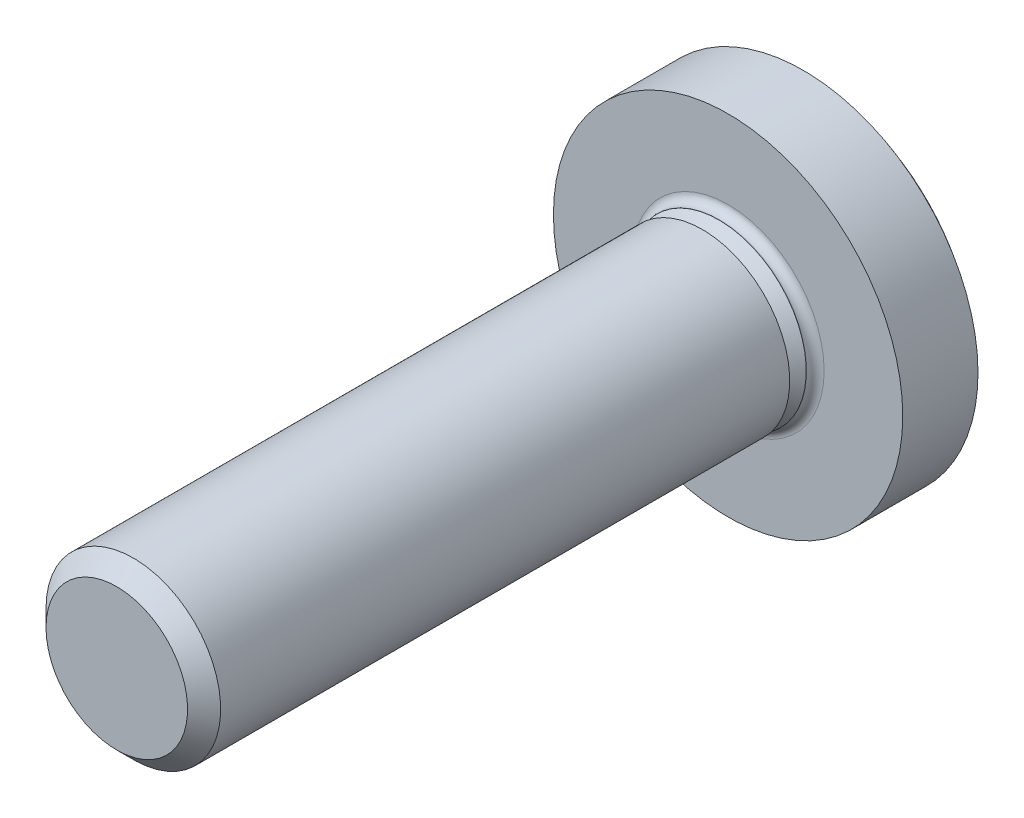
ISO-10303-21;
HEADER;
FILE_DESCRIPTION(('STEP AP214'),'2;1');
FILE_NAME('part.step','',(''),(''),'','','');
FILE_SCHEMA(('AUTOMOTIVE_DESIGN { 1 0 10303 214 1 1 1 1 }'));
ENDSEC;
DATA;
#1=APPLICATION_CONTEXT('core data for automotive mechanical design processes');
#2=APPLICATION_PROTOCOL_DEFINITION('international standard','automotive_design',2000,#1);
#3=PRODUCT_CONTEXT('',#1,'mechanical');
#4=PRODUCT('Part','Part','',(#3));
#5=PRODUCT_RELATED_PRODUCT_CATEGORY('part','',(#4));
#6=PRODUCT_DEFINITION_FORMATION('','',#4);
#7=PRODUCT_DEFINITION_CONTEXT('part definition',#1,'design');
#8=PRODUCT_DEFINITION('design','',#6,#7);
#9=PRODUCT_DEFINITION_SHAPE('','',#8);
#10=(LENGTH_UNIT() NAMED_UNIT(*) SI_UNIT(.MILLI.,.METRE.));
#11=(NAMED_UNIT(*) PLANE_ANGLE_UNIT() SI_UNIT($,.RADIAN.));
#12=(NAMED_UNIT(*) SI_UNIT($,.STERADIAN.) SOLID_ANGLE_UNIT());
#13=UNCERTAINTY_MEASURE_WITH_UNIT(LENGTH_MEASURE(1.E-05),#10,'distance_accuracy_value','');
#14=(GEOMETRIC_REPRESENTATION_CONTEXT(3) GLOBAL_UNCERTAINTY_ASSIGNED_CONTEXT((#13)) GLOBAL_UNIT_ASSIGNED_CONTEXT((#10,
#11,#12)) REPRESENTATION_CONTEXT('',''));
#15=CARTESIAN_POINT('',(0.,0.,0.));
#16=DIRECTION('',(0.,0.,1.));
#17=DIRECTION('',(1.,0.,0.));
#18=AXIS2_PLACEMENT_3D('',#15,#16,#17);
#19=CARTESIAN_POINT('',(0.,0.,6.5));
#20=DIRECTION('',(0.,0.,-1.));
#21=DIRECTION('',(0.,1.,0.));
#22=AXIS2_PLACEMENT_3D('',#19,#20,#21);
#23=SPHERICAL_SURFACE('',#22,6.5);
#24=CARTESIAN_POINT('',(0.,0.,1.3765246170202));
#25=DIRECTION('',(0.,0.,-1.));
#26=DIRECTION('',(-1.,0.,0.));
#27=AXIS2_PLACEMENT_3D('',#24,#25,#26);
#28=CIRCLE('',#27,4.);
#29=CARTESIAN_POINT('',(-4.,0.,1.3765246170202));
#30=VERTEX_POINT('',#29);
#31=EDGE_CURVE('E160',#30,#30,#28,.T.);
#32=ORIENTED_EDGE('',*,*,#31,.T.);
#33=EDGE_LOOP('',(#32));
#34=FACE_BOUND('',#33,.T.);
#35=CARTESIAN_POINT('',(-0.405545392562274,0.189108922281263,6.3801008200685));
#36=DIRECTION('',(-0.875426098065593,0.408217893676735,-0.258819045102521));
#37=DIRECTION('',(-0.422618261740699,-0.90630778703665,0.));
#38=AXIS2_PLACEMENT_3D('',#35,#36,#37);
#39=CIRCLE('',#38,6.48347090197349);
#40=CARTESIAN_POINT('',(0.92299563807694,-0.92299563807694,0.132413478861721));
#41=VERTEX_POINT('',#40);
#42=CARTESIAN_POINT('',(0.305622674506346,-2.10418012593627,0.35760463838069));
#43=VERTEX_POINT('',#42);
#44=EDGE_CURVE('E9',#41,#43,#39,.T.);
#45=ORIENTED_EDGE('',*,*,#44,.F.);
#46=CARTESIAN_POINT('',(-0.189108922281263,0.405545392562274,6.3801008200685));
#47=DIRECTION('',(-0.408217893676735,0.875426098065593,-0.258819045102521));
#48=DIRECTION('',(-0.90630778703665,-0.422618261740699,0.));
#49=AXIS2_PLACEMENT_3D('',#46,#47,#48);
#50=CIRCLE('',#49,6.48347090197349);
#51=CARTESIAN_POINT('',(2.10418012593627,-0.305622674506346,0.357604638380691));
#52=VERTEX_POINT('',#51);
#53=EDGE_CURVE('E24',#52,#41,#50,.T.);
#54=ORIENTED_EDGE('',*,*,#53,.F.);
#55=CARTESIAN_POINT('',(0.427627944162883,0.,6.61458256229943));
#56=DIRECTION('',(-0.965925826289068,0.,-0.258819045102521));
#57=DIRECTION('',(-0.258819045102521,0.,0.965925826289068));
#58=AXIS2_PLACEMENT_3D('',#55,#56,#57);
#59=CIRCLE('',#58,6.48490594980281);
#60=CARTESIAN_POINT('',(2.10418012593627,0.305622674506346,0.357604638380691));
#61=VERTEX_POINT('',#60);
#62=EDGE_CURVE('E224',#61,#52,#59,.T.);
#63=ORIENTED_EDGE('',*,*,#62,.F.);
#64=CARTESIAN_POINT('',(-0.189108922281263,-0.405545392562275,6.3801008200685));
#65=DIRECTION('',(-0.408217893676735,-0.875426098065593,-0.258819045102521));
#66=DIRECTION('',(0.90630778703665,-0.422618261740699,0.));
#67=AXIS2_PLACEMENT_3D('',#64,#65,#66);
#68=CIRCLE('',#67,6.48347090197349);
#69=CARTESIAN_POINT('',(0.922995638076941,0.922995638076939,0.132413478861721));
#70=VERTEX_POINT('',#69);
#71=EDGE_CURVE('E221',#70,#61,#68,.T.);
#72=ORIENTED_EDGE('',*,*,#71,.F.);
#73=CARTESIAN_POINT('',(-0.405545392562273,-0.189108922281263,6.3801008200685));
#74=DIRECTION('',(-0.875426098065593,-0.408217893676735,-0.258819045102521));
#75=DIRECTION('',(0.422618261740699,-0.90630778703665,0.));
#76=AXIS2_PLACEMENT_3D('',#73,#74,#75);
#77=CIRCLE('',#76,6.48347090197349);
#78=CARTESIAN_POINT('',(0.305622674506346,2.10418012593627,0.35760463838069));
#79=VERTEX_POINT('',#78);
#80=EDGE_CURVE('E218',#79,#70,#77,.T.);
#81=ORIENTED_EDGE('',*,*,#80,.F.);
#82=CARTESIAN_POINT('',(0.,0.427627944162883,6.61458256229943));
#83=DIRECTION('',(0.,-0.965925826289068,-0.258819045102521));
#84=DIRECTION('',(0.,0.258819045102521,-0.965925826289068));
#85=AXIS2_PLACEMENT_3D('',#82,#83,#84);
#86=CIRCLE('',#85,6.48490594980281);
#87=CARTESIAN_POINT('',(-0.305622674506345,2.10418012593627,0.35760463838069));
#88=VERTEX_POINT('',#87);
#89=EDGE_CURVE('E215',#88,#79,#86,.T.);
#90=ORIENTED_EDGE('',*,*,#89,.F.);
#91=CARTESIAN_POINT('',(0.405545392562275,-0.189108922281263,6.3801008200685));
#92=DIRECTION('',(0.875426098065593,-0.408217893676735,-0.258819045102521));
#93=DIRECTION('',(0.422618261740699,0.90630778703665,0.));
#94=AXIS2_PLACEMENT_3D('',#91,#92,#93);
#95=CIRCLE('',#94,6.48347090197349);
#96=CARTESIAN_POINT('',(-0.92299563807694,0.922995638076941,0.132413478861721));
#97=VERTEX_POINT('',#96);
#98=EDGE_CURVE('E212',#97,#88,#95,.T.);
#99=ORIENTED_EDGE('',*,*,#98,.F.);
#100=CARTESIAN_POINT('',(0.189108922281263,-0.405545392562273,6.3801008200685));
#101=DIRECTION('',(0.408217893676735,-0.875426098065593,-0.258819045102521));
#102=DIRECTION('',(0.90630778703665,0.422618261740699,0.));
#103=AXIS2_PLACEMENT_3D('',#100,#101,#102);
#104=CIRCLE('',#103,6.48347090197349);
#105=CARTESIAN_POINT('',(-2.10418012593627,0.305622674506346,0.35760463838069));
#106=VERTEX_POINT('',#105);
#107=EDGE_CURVE('E209',#106,#97,#104,.T.);
#108=ORIENTED_EDGE('',*,*,#107,.F.);
#109=CARTESIAN_POINT('',(-0.427627944162883,0.,6.61458256229943));
#110=DIRECTION('',(0.965925826289068,0.,-0.258819045102521));
#111=DIRECTION('',(-0.258819045102521,0.,-0.965925826289068));
#112=AXIS2_PLACEMENT_3D('',#109,#110,#111);
#113=CIRCLE('',#112,6.48490594980281);
#114=CARTESIAN_POINT('',(-2.10418012593627,-0.305622674506345,0.357604638380691));
#115=VERTEX_POINT('',#114);
#116=EDGE_CURVE('E206',#115,#106,#113,.T.);
#117=ORIENTED_EDGE('',*,*,#116,.F.);
#118=CARTESIAN_POINT('',(0.189108922281264,0.405545392562274,6.3801008200685));
#119=DIRECTION('',(0.408217893676735,0.875426098065593,-0.258819045102521));
#120=DIRECTION('',(-0.90630778703665,0.422618261740699,0.));
#121=AXIS2_PLACEMENT_3D('',#118,#119,#120);
#122=CIRCLE('',#121,6.48347090197349);
#123=CARTESIAN_POINT('',(-0.922995638076941,-0.92299563807694,0.132413478861721));
#124=VERTEX_POINT('',#123);
#125=EDGE_CURVE('E203',#124,#115,#122,.T.);
#126=ORIENTED_EDGE('',*,*,#125,.F.);
#127=CARTESIAN_POINT('',(0.405545392562273,0.189108922281263,6.3801008200685));
#128=DIRECTION('',(0.875426098065593,0.408217893676735,-0.258819045102521));
#129=DIRECTION('',(-0.422618261740699,0.90630778703665,0.));
#130=AXIS2_PLACEMENT_3D('',#127,#128,#129);
#131=CIRCLE('',#130,6.48347090197349);
#132=CARTESIAN_POINT('',(-0.305622674506346,-2.10418012593627,0.357604638380691));
#133=VERTEX_POINT('',#132);
#134=EDGE_CURVE('E200',#133,#124,#131,.T.);
#135=ORIENTED_EDGE('',*,*,#134,.F.);
#136=CARTESIAN_POINT('',(0.,-0.427627944162883,6.61458256229943));
#137=DIRECTION('',(0.,0.965925826289068,-0.258819045102521));
#138=DIRECTION('',(0.,0.258819045102521,0.965925826289068));
#139=AXIS2_PLACEMENT_3D('',#136,#137,#138);
#140=CIRCLE('',#139,6.48490594980281);
#141=EDGE_CURVE('E197',#43,#133,#140,.T.);
#142=ORIENTED_EDGE('',*,*,#141,.F.);
#143=EDGE_LOOP('',(#45,#54,#63,#72,#81,#90,#99,#108,#117,#126,#135,#142));
#144=FACE_BOUND('',#143,.T.);
#145=ADVANCED_FACE('F15',(#34,#144),#23,.T.);
#146=CARTESIAN_POINT('',(0.,0.,17.1));
#147=DIRECTION('',(0.,0.,-1.));
#148=DIRECTION('',(-1.,0.,0.));
#149=AXIS2_PLACEMENT_3D('',#146,#147,#148);
#150=PLANE('',#149);
#151=CARTESIAN_POINT('',(0.,0.,17.1));
#152=DIRECTION('',(0.,0.,-1.));
#153=DIRECTION('',(-1.,0.,0.));
#154=AXIS2_PLACEMENT_3D('',#151,#152,#153);
#155=CIRCLE('',#154,1.621125);
#156=CARTESIAN_POINT('',(-1.621125,0.,17.1));
#157=VERTEX_POINT('',#156);
#158=EDGE_CURVE('E193',#157,#157,#155,.T.);
#159=ORIENTED_EDGE('',*,*,#158,.F.);
#160=EDGE_LOOP('',(#159));
#161=FACE_BOUND('',#160,.T.);
#162=ADVANCED_FACE('F17',(#161),#150,.F.);
#163=CARTESIAN_POINT('',(0.,0.,17.1));
#164=DIRECTION('',(0.,0.,-1.));
#165=DIRECTION('',(-1.,0.,0.));
#166=AXIS2_PLACEMENT_3D('',#163,#164,#165);
#167=CONICAL_SURFACE('',#166,1.621125,0.785398163397448);
#168=CARTESIAN_POINT('',(0.,0.,16.721125));
#169=DIRECTION('',(0.,0.,-1.));
#170=DIRECTION('',(-1.,0.,0.));
#171=AXIS2_PLACEMENT_3D('',#168,#169,#170);
#172=CIRCLE('',#171,2.);
#173=CARTESIAN_POINT('',(-2.,0.,16.721125));
#174=VERTEX_POINT('',#173);
#175=EDGE_CURVE('E189',#174,#174,#172,.T.);
#176=ORIENTED_EDGE('',*,*,#175,.F.);
#177=EDGE_LOOP('',(#176));
#178=FACE_BOUND('',#177,.T.);
#179=ORIENTED_EDGE('',*,*,#158,.T.);
#180=EDGE_LOOP('',(#179));
#181=FACE_BOUND('',#180,.T.);
#182=ADVANCED_FACE('F245',(#178,#181),#167,.T.);
#183=CARTESIAN_POINT('',(0.,0.,0.));
#184=DIRECTION('',(0.,0.,-1.));
#185=DIRECTION('',(-1.,0.,0.));
#186=AXIS2_PLACEMENT_3D('',#183,#184,#185);
#187=CYLINDRICAL_SURFACE('',#186,2.);
#188=CARTESIAN_POINT('',(0.,0.,3.688875));
#189=DIRECTION('',(0.,0.,-1.));
#190=DIRECTION('',(-1.,0.,0.));
#191=AXIS2_PLACEMENT_3D('',#188,#189,#190);
#192=CIRCLE('',#191,2.);
#193=CARTESIAN_POINT('',(-2.,0.,3.688875));
#194=VERTEX_POINT('',#193);
#195=EDGE_CURVE('E185',#194,#194,#192,.T.);
#196=ORIENTED_EDGE('',*,*,#195,.F.);
#197=EDGE_LOOP('',(#196));
#198=FACE_BOUND('',#197,.T.);
#199=ORIENTED_EDGE('',*,*,#175,.T.);
#200=EDGE_LOOP('',(#199));
#201=FACE_BOUND('',#200,.T.);
#202=ADVANCED_FACE('F256',(#198,#201),#187,.T.);
#203=CARTESIAN_POINT('',(0.,2.,3.688875));
#204=DIRECTION('',(0.,0.,1.));
#205=DIRECTION('',(1.,0.,0.));
#206=AXIS2_PLACEMENT_3D('',#203,#204,#205);
#207=PLANE('',#206);
#208=CARTESIAN_POINT('',(0.,0.,3.688875));
#209=DIRECTION('',(0.,0.,-1.));
#210=DIRECTION('',(-1.,0.,0.));
#211=AXIS2_PLACEMENT_3D('',#208,#209,#210);
#212=CIRCLE('',#211,1.621125);
#213=CARTESIAN_POINT('',(-1.621125,0.,3.688875));
#214=VERTEX_POINT('',#213);
#215=EDGE_CURVE('E181',#214,#214,#212,.T.);
#216=ORIENTED_EDGE('',*,*,#215,.F.);
#217=EDGE_LOOP('',(#216));
#218=FACE_BOUND('',#217,.T.);
#219=ORIENTED_EDGE('',*,*,#195,.T.);
#220=EDGE_LOOP('',(#219));
#221=FACE_BOUND('',#220,.T.);
#222=ADVANCED_FACE('F265',(#218,#221),#207,.F.);
#223=CARTESIAN_POINT('',(0.,0.,3.688875));
#224=DIRECTION('',(0.,0.,-1.));
#225=DIRECTION('',(-1.,0.,0.));
#226=AXIS2_PLACEMENT_3D('',#223,#224,#225);
#227=CONICAL_SURFACE('',#226,1.621125,0.785398163397448);
#228=CARTESIAN_POINT('',(0.,0.,3.31));
#229=DIRECTION('',(0.,0.,-1.));
#230=DIRECTION('',(-1.,0.,0.));
#231=AXIS2_PLACEMENT_3D('',#228,#229,#230);
#232=CIRCLE('',#231,2.);
#233=CARTESIAN_POINT('',(-2.,0.,3.31));
#234=VERTEX_POINT('',#233);
#235=EDGE_CURVE('E177',#234,#234,#232,.T.);
#236=ORIENTED_EDGE('',*,*,#235,.F.);
#237=EDGE_LOOP('',(#236));
#238=FACE_BOUND('',#237,.T.);
#239=ORIENTED_EDGE('',*,*,#215,.T.);
#240=EDGE_LOOP('',(#239));
#241=FACE_BOUND('',#240,.T.);
#242=ADVANCED_FACE('F275',(#238,#241),#227,.T.);
#243=CARTESIAN_POINT('',(0.,0.,0.));
#244=DIRECTION('',(0.,0.,-1.));
#245=DIRECTION('',(-1.,0.,0.));
#246=AXIS2_PLACEMENT_3D('',#243,#244,#245);
#247=CYLINDRICAL_SURFACE('',#246,2.);
#248=CARTESIAN_POINT('',(0.,0.,3.3));
#249=DIRECTION('',(0.,0.,-1.));
#250=DIRECTION('',(-1.,0.,0.));
#251=AXIS2_PLACEMENT_3D('',#248,#249,#250);
#252=CIRCLE('',#251,2.);
#253=CARTESIAN_POINT('',(-2.,0.,3.3));
#254=VERTEX_POINT('',#253);
#255=EDGE_CURVE('E173',#254,#254,#252,.T.);
#256=ORIENTED_EDGE('',*,*,#255,.F.);
#257=EDGE_LOOP('',(#256));
#258=FACE_BOUND('',#257,.T.);
#259=ORIENTED_EDGE('',*,*,#235,.T.);
#260=EDGE_LOOP('',(#259));
#261=FACE_BOUND('',#260,.T.);
#262=ADVANCED_FACE('F285',(#258,#261),#247,.T.);
#263=CARTESIAN_POINT('',(0.,0.,3.3));
#264=DIRECTION('',(0.,0.,-1.));
#265=DIRECTION('',(-1.,0.,0.));
#266=AXIS2_PLACEMENT_3D('',#263,#264,#265);
#267=TOROIDAL_SURFACE('',#266,2.2,0.2);
#268=ORIENTED_EDGE('',*,*,#255,.T.);
#269=EDGE_LOOP('',(#268));
#270=FACE_BOUND('',#269,.T.);
#271=CARTESIAN_POINT('',(0.,0.,3.1));
#272=DIRECTION('',(0.,0.,-1.));
#273=DIRECTION('',(-1.,0.,0.));
#274=AXIS2_PLACEMENT_3D('',#271,#272,#273);
#275=CIRCLE('',#274,2.2);
#276=CARTESIAN_POINT('',(-2.2,0.,3.1));
#277=VERTEX_POINT('',#276);
#278=EDGE_CURVE('E169',#277,#277,#275,.T.);
#279=ORIENTED_EDGE('',*,*,#278,.F.);
#280=EDGE_LOOP('',(#279));
#281=FACE_BOUND('',#280,.T.);
#282=ADVANCED_FACE('F295',(#270,#281),#267,.F.);
#283=CARTESIAN_POINT('',(0.,2.2,3.1));
#284=DIRECTION('',(0.,0.,-1.));
#285=DIRECTION('',(-1.,0.,0.));
#286=AXIS2_PLACEMENT_3D('',#283,#284,#285);
#287=PLANE('',#286);
#288=CARTESIAN_POINT('',(0.,0.,3.1));
#289=DIRECTION('',(0.,0.,-1.));
#290=DIRECTION('',(-1.,0.,0.));
#291=AXIS2_PLACEMENT_3D('',#288,#289,#290);
#292=CIRCLE('',#291,4.);
#293=CARTESIAN_POINT('',(-4.,0.,3.1));
#294=VERTEX_POINT('',#293);
#295=EDGE_CURVE('E164',#294,#294,#292,.T.);
#296=ORIENTED_EDGE('',*,*,#295,.F.);
#297=EDGE_LOOP('',(#296));
#298=FACE_BOUND('',#297,.T.);
#299=ORIENTED_EDGE('',*,*,#278,.T.);
#300=EDGE_LOOP('',(#299));
#301=FACE_BOUND('',#300,.T.);
#302=ADVANCED_FACE('F305',(#298,#301),#287,.F.);
#303=CARTESIAN_POINT('',(0.,0.,0.));
#304=DIRECTION('',(0.,0.,-1.));
#305=DIRECTION('',(-1.,0.,0.));
#306=AXIS2_PLACEMENT_3D('',#303,#304,#305);
#307=CYLINDRICAL_SURFACE('',#306,4.);
#308=ORIENTED_EDGE('',*,*,#31,.F.);
#309=EDGE_LOOP('',(#308));
#310=FACE_BOUND('',#309,.T.);
#311=ORIENTED_EDGE('',*,*,#295,.T.);
#312=EDGE_LOOP('',(#311));
#313=FACE_BOUND('',#312,.T.);
#314=ADVANCED_FACE('F315',(#310,#313),#307,.T.);
#315=CARTESIAN_POINT('',(0.366666666666667,-2.2,0.));
#316=DIRECTION('',(-0.875426098065593,0.408217893676735,-0.258819045102521));
#317=DIRECTION('',(-0.422618261740699,-0.90630778703665,0.));
#318=AXIS2_PLACEMENT_3D('',#315,#316,#317);
#319=PLANE('',#318);
#320=ORIENTED_EDGE('',*,*,#44,.T.);
#321=DIRECTION('',(0.162689201767992,-0.255370893567974,-0.953057149569945));
#322=VECTOR('',#321,1.);
#323=CARTESIAN_POINT('',(0.366666666666667,-2.2,0.));
#324=LINE('',#323,#322);
#325=CARTESIAN_POINT('',(0.0423319890466869,-1.69089653438087,1.9));
#326=VERTEX_POINT('',#325);
#327=EDGE_CURVE('E31',#326,#43,#324,.T.);
#328=ORIENTED_EDGE('',*,*,#327,.F.);
#329=DIRECTION('',(0.422618261740699,0.90630778703665,0.));
#330=VECTOR('',#329,1.);
#331=CARTESIAN_POINT('',(0.149047069992156,-1.46204530477057,1.9));
#332=LINE('',#331,#330);
#333=CARTESIAN_POINT('',(0.566600049829658,-0.566600049829659,1.9));
#334=VERTEX_POINT('',#333);
#335=EDGE_CURVE('E117',#326,#334,#332,.T.);
#336=ORIENTED_EDGE('',*,*,#335,.T.);
#337=DIRECTION('',(0.193899607686987,-0.193899607686987,-0.961668281829896));
#338=VECTOR('',#337,1.);
#339=CARTESIAN_POINT('',(0.974781670177971,-0.974781670177972,-0.12442553751102));
#340=LINE('',#339,#338);
#341=EDGE_CURVE('E165',#334,#41,#340,.T.);
#342=ORIENTED_EDGE('',*,*,#341,.T.);
#343=EDGE_LOOP('',(#320,#328,#336,#342));
#344=FACE_BOUND('',#343,.T.);
#345=ADVANCED_FACE('F116',(#344),#319,.T.);
#346=CARTESIAN_POINT('',(0.949693951922647,-0.949693951922649,0.));
#347=DIRECTION('',(-0.408217893676735,0.875426098065593,-0.258819045102521));
#348=DIRECTION('',(-0.90630778703665,-0.422618261740699,0.));
#349=AXIS2_PLACEMENT_3D('',#346,#347,#348);
#350=PLANE('',#349);
#351=ORIENTED_EDGE('',*,*,#53,.T.);
#352=ORIENTED_EDGE('',*,*,#341,.F.);
#353=DIRECTION('',(0.90630778703665,0.422618261740699,0.));
#354=VECTOR('',#353,1.);
#355=CARTESIAN_POINT('',(0.177234242228863,-0.748164307737616,1.9));
#356=LINE('',#355,#354);
#357=CARTESIAN_POINT('',(1.69089653438087,-0.0423319890466872,1.9));
#358=VERTEX_POINT('',#357);
#359=EDGE_CURVE('E124',#334,#358,#356,.T.);
#360=ORIENTED_EDGE('',*,*,#359,.T.);
#361=DIRECTION('',(0.255370893567974,-0.162689201767992,-0.953057149569945));
#362=VECTOR('',#361,1.);
#363=CARTESIAN_POINT('',(2.2,-0.366666666666667,0.));
#364=LINE('',#363,#362);
#365=EDGE_CURVE('E506',#358,#52,#364,.T.);
#366=ORIENTED_EDGE('',*,*,#365,.T.);
#367=EDGE_LOOP('',(#351,#352,#360,#366));
#368=FACE_BOUND('',#367,.T.);
#369=ADVANCED_FACE('F333',(#368),#350,.T.);
#370=CARTESIAN_POINT('',(2.2,-0.366666666666667,0.));
#371=DIRECTION('',(-0.965925826289068,0.,-0.258819045102521));
#372=DIRECTION('',(-0.258819045102521,0.,0.965925826289068));
#373=AXIS2_PLACEMENT_3D('',#370,#371,#372);
#374=PLANE('',#373);
#375=ORIENTED_EDGE('',*,*,#62,.T.);
#376=ORIENTED_EDGE('',*,*,#365,.F.);
#377=DIRECTION('',(0.,1.,0.));
#378=VECTOR('',#377,1.);
#379=CARTESIAN_POINT('',(1.69089653438087,-1.67720172645669,1.9));
#380=LINE('',#379,#378);
#381=CARTESIAN_POINT('',(1.69089653438087,0.0423319890466869,1.9));
#382=VERTEX_POINT('',#381);
#383=EDGE_CURVE('E131',#358,#382,#380,.T.);
#384=ORIENTED_EDGE('',*,*,#383,.T.);
#385=DIRECTION('',(0.255370893567974,0.162689201767992,-0.953057149569945));
#386=VECTOR('',#385,1.);
#387=CARTESIAN_POINT('',(2.2,0.366666666666667,0.));
#388=LINE('',#387,#386);
#389=EDGE_CURVE('E503',#382,#61,#388,.T.);
#390=ORIENTED_EDGE('',*,*,#389,.T.);
#391=EDGE_LOOP('',(#375,#376,#384,#390));
#392=FACE_BOUND('',#391,.T.);
#393=ADVANCED_FACE('F348',(#392),#374,.T.);
#394=CARTESIAN_POINT('',(2.2,0.366666666666667,0.));
#395=DIRECTION('',(-0.408217893676735,-0.875426098065593,-0.258819045102521));
#396=DIRECTION('',(0.90630778703665,-0.422618261740699,0.));
#397=AXIS2_PLACEMENT_3D('',#394,#395,#396);
#398=PLANE('',#397);
#399=ORIENTED_EDGE('',*,*,#71,.T.);
#400=ORIENTED_EDGE('',*,*,#389,.F.);
#401=DIRECTION('',(-0.90630778703665,0.422618261740699,0.));
#402=VECTOR('',#401,1.);
#403=CARTESIAN_POINT('',(1.46204530477057,0.149047069992157,1.9));
#404=LINE('',#403,#402);
#405=CARTESIAN_POINT('',(0.566600049829659,0.566600049829658,1.9));
#406=VERTEX_POINT('',#405);
#407=EDGE_CURVE('E137',#382,#406,#404,.T.);
#408=ORIENTED_EDGE('',*,*,#407,.T.);
#409=DIRECTION('',(0.193899607686987,0.193899607686987,-0.961668281829896));
#410=VECTOR('',#409,1.);
#411=CARTESIAN_POINT('',(0.974781670177972,0.97478167017797,-0.12442553751102));
#412=LINE('',#411,#410);
#413=EDGE_CURVE('E500',#406,#70,#412,.T.);
#414=ORIENTED_EDGE('',*,*,#413,.T.);
#415=EDGE_LOOP('',(#399,#400,#408,#414));
#416=FACE_BOUND('',#415,.T.);
#417=ADVANCED_FACE('F357',(#416),#398,.T.);
#418=CARTESIAN_POINT('',(0.949693951922649,0.949693951922647,0.));
#419=DIRECTION('',(-0.875426098065593,-0.408217893676735,-0.258819045102521));
#420=DIRECTION('',(0.422618261740699,-0.90630778703665,0.));
#421=AXIS2_PLACEMENT_3D('',#418,#419,#420);
#422=PLANE('',#421);
#423=ORIENTED_EDGE('',*,*,#80,.T.);
#424=ORIENTED_EDGE('',*,*,#413,.F.);
#425=DIRECTION('',(-0.422618261740699,0.90630778703665,0.));
#426=VECTOR('',#425,1.);
#427=CARTESIAN_POINT('',(1.43385813253386,-1.29324091039736,1.9));
#428=LINE('',#427,#426);
#429=CARTESIAN_POINT('',(0.0423319890466871,1.69089653438087,1.9));
#430=VERTEX_POINT('',#429);
#431=EDGE_CURVE('E140',#406,#430,#428,.T.);
#432=ORIENTED_EDGE('',*,*,#431,.T.);
#433=DIRECTION('',(0.162689201767992,0.255370893567974,-0.953057149569945));
#434=VECTOR('',#433,1.);
#435=CARTESIAN_POINT('',(0.366666666666667,2.2,0.));
#436=LINE('',#435,#434);
#437=EDGE_CURVE('E497',#430,#79,#436,.T.);
#438=ORIENTED_EDGE('',*,*,#437,.T.);
#439=EDGE_LOOP('',(#423,#424,#432,#438));
#440=FACE_BOUND('',#439,.T.);
#441=ADVANCED_FACE('F368',(#440),#422,.T.);
#442=CARTESIAN_POINT('',(0.366666666666667,2.2,0.));
#443=DIRECTION('',(0.,-0.965925826289068,-0.258819045102521));
#444=DIRECTION('',(0.,0.258819045102521,-0.965925826289068));
#445=AXIS2_PLACEMENT_3D('',#442,#443,#444);
#446=PLANE('',#445);
#447=ORIENTED_EDGE('',*,*,#89,.T.);
#448=ORIENTED_EDGE('',*,*,#437,.F.);
#449=DIRECTION('',(-1.,0.,0.));
#450=VECTOR('',#449,1.);
#451=CARTESIAN_POINT('',(0.610451505290122,1.69089653438087,1.9));
#452=LINE('',#451,#450);
#453=CARTESIAN_POINT('',(-0.0423319890466866,1.69089653438087,1.9));
#454=VERTEX_POINT('',#453);
#455=EDGE_CURVE('E143',#430,#454,#452,.T.);
#456=ORIENTED_EDGE('',*,*,#455,.T.);
#457=DIRECTION('',(-0.162689201767992,0.255370893567974,-0.953057149569945));
#458=VECTOR('',#457,1.);
#459=CARTESIAN_POINT('',(-0.366666666666667,2.2,0.));
#460=LINE('',#459,#458);
#461=EDGE_CURVE('E494',#454,#88,#460,.T.);
#462=ORIENTED_EDGE('',*,*,#461,.T.);
#463=EDGE_LOOP('',(#447,#448,#456,#462));
#464=FACE_BOUND('',#463,.T.);
#465=ADVANCED_FACE('F379',(#464),#446,.T.);
#466=CARTESIAN_POINT('',(-0.366666666666667,2.2,0.));
#467=DIRECTION('',(0.875426098065593,-0.408217893676735,-0.258819045102521));
#468=DIRECTION('',(0.422618261740699,0.90630778703665,0.));
#469=AXIS2_PLACEMENT_3D('',#466,#467,#468);
#470=PLANE('',#469);
#471=ORIENTED_EDGE('',*,*,#98,.T.);
#472=ORIENTED_EDGE('',*,*,#461,.F.);
#473=DIRECTION('',(-0.422618261740699,-0.90630778703665,0.));
#474=VECTOR('',#473,1.);
#475=CARTESIAN_POINT('',(-1.21579729115873,-0.825607926976247,1.9));
#476=LINE('',#475,#474);
#477=CARTESIAN_POINT('',(-0.566600049829658,0.56660004982966,1.9));
#478=VERTEX_POINT('',#477);
#479=EDGE_CURVE('E146',#454,#478,#476,.T.);
#480=ORIENTED_EDGE('',*,*,#479,.T.);
#481=DIRECTION('',(-0.193899607686987,0.193899607686987,-0.961668281829896));
#482=VECTOR('',#481,1.);
#483=CARTESIAN_POINT('',(-0.97478167017797,0.974781670177972,-0.12442553751102));
#484=LINE('',#483,#482);
#485=EDGE_CURVE('E491',#478,#97,#484,.T.);
#486=ORIENTED_EDGE('',*,*,#485,.T.);
#487=EDGE_LOOP('',(#471,#472,#480,#486));
#488=FACE_BOUND('',#487,.T.);
#489=ADVANCED_FACE('F390',(#488),#470,.T.);
#490=CARTESIAN_POINT('',(-0.949693951922647,0.949693951922649,0.));
#491=DIRECTION('',(0.408217893676735,-0.875426098065593,-0.258819045102521));
#492=DIRECTION('',(0.90630778703665,0.422618261740699,0.));
#493=AXIS2_PLACEMENT_3D('',#490,#491,#492);
#494=PLANE('',#493);
#495=ORIENTED_EDGE('',*,*,#107,.T.);
#496=ORIENTED_EDGE('',*,*,#485,.F.);
#497=DIRECTION('',(-0.90630778703665,-0.422618261740699,0.));
#498=VECTOR('',#497,1.);
#499=CARTESIAN_POINT('',(-0.459203135565461,0.616680053413271,1.9));
#500=LINE('',#499,#498);
#501=CARTESIAN_POINT('',(-1.69089653438087,0.0423319890466875,1.9));
#502=VERTEX_POINT('',#501);
#503=EDGE_CURVE('E149',#478,#502,#500,.T.);
#504=ORIENTED_EDGE('',*,*,#503,.T.);
#505=DIRECTION('',(-0.255370893567974,0.162689201767992,-0.953057149569945));
#506=VECTOR('',#505,1.);
#507=CARTESIAN_POINT('',(-2.2,0.366666666666668,0.));
#508=LINE('',#507,#506);
#509=EDGE_CURVE('E488',#502,#106,#508,.T.);
#510=ORIENTED_EDGE('',*,*,#509,.T.);
#511=EDGE_LOOP('',(#495,#496,#504,#510));
#512=FACE_BOUND('',#511,.T.);
#513=ADVANCED_FACE('F401',(#512),#494,.T.);
#514=CARTESIAN_POINT('',(-2.2,0.366666666666668,0.));
#515=DIRECTION('',(0.965925826289068,0.,-0.258819045102521));
#516=DIRECTION('',(-0.258819045102521,0.,-0.965925826289068));
#517=AXIS2_PLACEMENT_3D('',#514,#515,#516);
#518=PLANE('',#517);
#519=ORIENTED_EDGE('',*,*,#116,.T.);
#520=ORIENTED_EDGE('',*,*,#509,.F.);
#521=DIRECTION('',(0.,-1.,0.));
#522=VECTOR('',#521,1.);
#523=CARTESIAN_POINT('',(-1.69089653438087,-1.67720172645669,1.9));
#524=LINE('',#523,#522);
#525=CARTESIAN_POINT('',(-1.69089653438087,-0.0423319890466864,1.9));
#526=VERTEX_POINT('',#525);
#527=EDGE_CURVE('E152',#502,#526,#524,.T.);
#528=ORIENTED_EDGE('',*,*,#527,.T.);
#529=DIRECTION('',(-0.255370893567974,-0.162689201767992,-0.953057149569945));
#530=VECTOR('',#529,1.);
#531=CARTESIAN_POINT('',(-2.2,-0.366666666666667,0.));
#532=LINE('',#531,#530);
#533=EDGE_CURVE('E483',#526,#115,#532,.T.);
#534=ORIENTED_EDGE('',*,*,#533,.T.);
#535=EDGE_LOOP('',(#519,#520,#528,#534));
#536=FACE_BOUND('',#535,.T.);
#537=ADVANCED_FACE('F412',(#536),#518,.T.);
#538=CARTESIAN_POINT('',(-2.2,-0.366666666666667,0.));
#539=DIRECTION('',(0.408217893676735,0.875426098065593,-0.258819045102521));
#540=DIRECTION('',(-0.90630778703665,0.422618261740699,0.));
#541=AXIS2_PLACEMENT_3D('',#538,#539,#540);
#542=PLANE('',#541);
#543=ORIENTED_EDGE('',*,*,#125,.T.);
#544=ORIENTED_EDGE('',*,*,#533,.F.);
#545=DIRECTION('',(0.90630778703665,-0.422618261740699,0.));
#546=VECTOR('',#545,1.);
#547=CARTESIAN_POINT('',(0.825607926976246,-1.21579729115873,1.9));
#548=LINE('',#547,#546);
#549=CARTESIAN_POINT('',(-0.56660004982966,-0.566600049829658,1.9));
#550=VERTEX_POINT('',#549);
#551=EDGE_CURVE('E155',#526,#550,#548,.T.);
#552=ORIENTED_EDGE('',*,*,#551,.T.);
#553=DIRECTION('',(-0.193899607686987,-0.193899607686987,-0.961668281829896));
#554=VECTOR('',#553,1.);
#555=CARTESIAN_POINT('',(-0.974781670177972,-0.97478167017797,-0.12442553751102));
#556=LINE('',#555,#554);
#557=EDGE_CURVE('E480',#550,#124,#556,.T.);
#558=ORIENTED_EDGE('',*,*,#557,.T.);
#559=EDGE_LOOP('',(#543,#544,#552,#558));
#560=FACE_BOUND('',#559,.T.);
#561=ADVANCED_FACE('F423',(#560),#542,.T.);
#562=CARTESIAN_POINT('',(-0.949693951922649,-0.949693951922647,0.));
#563=DIRECTION('',(0.875426098065593,0.408217893676735,-0.258819045102521));
#564=DIRECTION('',(-0.422618261740699,0.90630778703665,0.));
#565=AXIS2_PLACEMENT_3D('',#562,#563,#564);
#566=PLANE('',#565);
#567=ORIENTED_EDGE('',*,*,#134,.T.);
#568=ORIENTED_EDGE('',*,*,#557,.F.);
#569=DIRECTION('',(0.422618261740699,-0.90630778703665,0.));
#570=VECTOR('',#569,1.);
#571=CARTESIAN_POINT('',(0.0690137713829782,-1.92967828819168,1.9));
#572=LINE('',#571,#570);
#573=CARTESIAN_POINT('',(-0.0423319890466871,-1.69089653438087,1.9));
#574=VERTEX_POINT('',#573);
#575=EDGE_CURVE('E112',#550,#574,#572,.T.);
#576=ORIENTED_EDGE('',*,*,#575,.T.);
#577=DIRECTION('',(-0.162689201767992,-0.255370893567974,-0.953057149569945));
#578=VECTOR('',#577,1.);
#579=CARTESIAN_POINT('',(-0.366666666666667,-2.2,0.));
#580=LINE('',#579,#578);
#581=EDGE_CURVE('E107',#574,#133,#580,.T.);
#582=ORIENTED_EDGE('',*,*,#581,.T.);
#583=EDGE_LOOP('',(#567,#568,#576,#582));
#584=FACE_BOUND('',#583,.T.);
#585=ADVANCED_FACE('F434',(#584),#566,.T.);
#586=CARTESIAN_POINT('',(-0.366666666666667,-2.2,0.));
#587=DIRECTION('',(0.,0.965925826289068,-0.258819045102521));
#588=DIRECTION('',(0.,0.258819045102521,0.965925826289068));
#589=AXIS2_PLACEMENT_3D('',#586,#587,#588);
#590=PLANE('',#589);
#591=ORIENTED_EDGE('',*,*,#141,.T.);
#592=ORIENTED_EDGE('',*,*,#581,.F.);
#593=DIRECTION('',(1.,0.,0.));
#594=VECTOR('',#593,1.);
#595=CARTESIAN_POINT('',(0.610451505290122,-1.69089653438087,1.9));
#596=LINE('',#595,#594);
#597=EDGE_CURVE('E104',#574,#326,#596,.T.);
#598=ORIENTED_EDGE('',*,*,#597,.T.);
#599=ORIENTED_EDGE('',*,*,#327,.T.);
#600=EDGE_LOOP('',(#591,#592,#598,#599));
#601=FACE_BOUND('',#600,.T.);
#602=ADVANCED_FACE('F105',(#601),#590,.T.);
#603=CARTESIAN_POINT('',(0.610451505290122,-1.67720172645669,1.9));
#604=DIRECTION('',(0.,0.,-1.));
#605=DIRECTION('',(-1.,0.,0.));
#606=AXIS2_PLACEMENT_3D('',#603,#604,#605);
#607=PLANE('',#606);
#608=ORIENTED_EDGE('',*,*,#335,.F.);
#609=ORIENTED_EDGE('',*,*,#597,.F.);
#610=ORIENTED_EDGE('',*,*,#575,.F.);
#611=ORIENTED_EDGE('',*,*,#551,.F.);
#612=ORIENTED_EDGE('',*,*,#527,.F.);
#613=ORIENTED_EDGE('',*,*,#503,.F.);
#614=ORIENTED_EDGE('',*,*,#479,.F.);
#615=ORIENTED_EDGE('',*,*,#455,.F.);
#616=ORIENTED_EDGE('',*,*,#431,.F.);
#617=ORIENTED_EDGE('',*,*,#407,.F.);
#618=ORIENTED_EDGE('',*,*,#383,.F.);
#619=ORIENTED_EDGE('',*,*,#359,.F.);
#620=EDGE_LOOP('',(#608,#609,#610,#611,#612,#613,#614,#615,#616,#617,#618,#619));
#621=FACE_BOUND('',#620,.T.);
#622=ADVANCED_FACE('F122',(#621),#607,.T.);
#623=CLOSED_SHELL('',(#145,#162,#182,#202,#222,#242,#262,#282,#302,#314,#345,#369,#393,#417,
#441,#465,#489,#513,#537,#561,#585,#602,#622));
#624=MANIFOLD_SOLID_BREP('B1',#623);
#625=ADVANCED_BREP_SHAPE_REPRESENTATION('',(#18,#624),#14);
#626=SHAPE_DEFINITION_REPRESENTATION(#9,#625);
ENDSEC;
END-ISO-10303-21;
